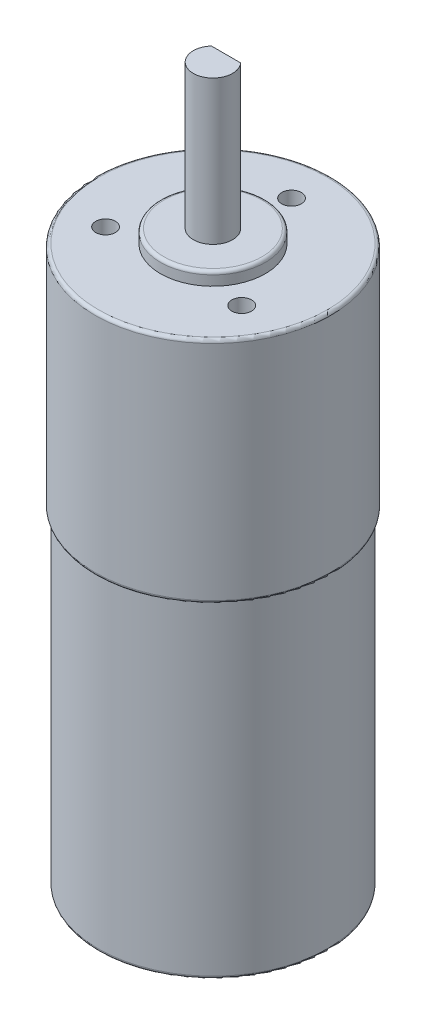
ISO-10303-21;
HEADER;
FILE_DESCRIPTION(('STEP AP214'),'2;1');
FILE_NAME('part.step','',(''),(''),'','','');
FILE_SCHEMA(('AUTOMOTIVE_DESIGN { 1 0 10303 214 1 1 1 1 }'));
ENDSEC;
DATA;
#1=APPLICATION_CONTEXT('core data for automotive mechanical design processes');
#2=APPLICATION_PROTOCOL_DEFINITION('international standard','automotive_design',2000,#1);
#3=PRODUCT_CONTEXT('',#1,'mechanical');
#4=PRODUCT('Part','Part','',(#3));
#5=PRODUCT_RELATED_PRODUCT_CATEGORY('part','',(#4));
#6=PRODUCT_DEFINITION_FORMATION('','',#4);
#7=PRODUCT_DEFINITION_CONTEXT('part definition',#1,'design');
#8=PRODUCT_DEFINITION('design','',#6,#7);
#9=PRODUCT_DEFINITION_SHAPE('','',#8);
#10=(LENGTH_UNIT() NAMED_UNIT(*) SI_UNIT(.MILLI.,.METRE.));
#11=(NAMED_UNIT(*) PLANE_ANGLE_UNIT() SI_UNIT($,.RADIAN.));
#12=(NAMED_UNIT(*) SI_UNIT($,.STERADIAN.) SOLID_ANGLE_UNIT());
#13=UNCERTAINTY_MEASURE_WITH_UNIT(LENGTH_MEASURE(1.E-05),#10,'distance_accuracy_value','');
#14=(GEOMETRIC_REPRESENTATION_CONTEXT(3) GLOBAL_UNCERTAINTY_ASSIGNED_CONTEXT((#13)) GLOBAL_UNIT_ASSIGNED_CONTEXT((#10,
#11,#12)) REPRESENTATION_CONTEXT('',''));
#15=CARTESIAN_POINT('',(0.,0.,0.));
#16=DIRECTION('',(0.,0.,1.));
#17=DIRECTION('',(1.,0.,0.));
#18=AXIS2_PLACEMENT_3D('',#15,#16,#17);
#19=CARTESIAN_POINT('',(0.,87.,0.));
#20=DIRECTION('',(0.,1.,0.));
#21=DIRECTION('',(0.,0.,1.));
#22=AXIS2_PLACEMENT_3D('',#19,#20,#21);
#23=PLANE('',#22);
#24=CARTESIAN_POINT('',(0.,87.,0.));
#25=DIRECTION('',(0.,1.,0.));
#26=DIRECTION('',(0.,0.,1.));
#27=AXIS2_PLACEMENT_3D('',#24,#25,#26);
#28=CIRCLE('',#27,7.5);
#29=CARTESIAN_POINT('',(0.,87.,7.5));
#30=VERTEX_POINT('',#29);
#31=EDGE_CURVE('E45',#30,#30,#28,.T.);
#32=ORIENTED_EDGE('',*,*,#31,.T.);
#33=EDGE_LOOP('',(#32));
#34=FACE_BOUND('',#33,.T.);
#35=CARTESIAN_POINT('',(0.,87.,0.));
#36=DIRECTION('',(0.,1.,0.));
#37=DIRECTION('',(0.,0.,1.));
#38=AXIS2_PLACEMENT_3D('',#35,#36,#37);
#39=CIRCLE('',#38,3.);
#40=CARTESIAN_POINT('',(0.,87.,3.));
#41=VERTEX_POINT('',#40);
#42=EDGE_CURVE('E80',#41,#41,#39,.T.);
#43=ORIENTED_EDGE('',*,*,#42,.F.);
#44=EDGE_LOOP('',(#43));
#45=FACE_BOUND('',#44,.T.);
#46=ADVANCED_FACE('F37',(#34,#45),#23,.T.);
#47=CARTESIAN_POINT('',(0.,85.,0.));
#48=DIRECTION('',(0.,1.,0.));
#49=DIRECTION('',(0.,0.,1.));
#50=AXIS2_PLACEMENT_3D('',#47,#48,#49);
#51=PLANE('',#50);
#52=CARTESIAN_POINT('',(0.,85.,0.));
#53=DIRECTION('',(0.,1.,0.));
#54=DIRECTION('',(0.,0.,1.));
#55=AXIS2_PLACEMENT_3D('',#52,#53,#54);
#56=CIRCLE('',#55,17.5);
#57=CARTESIAN_POINT('',(0.,85.,17.5));
#58=VERTEX_POINT('',#57);
#59=EDGE_CURVE('E94',#58,#58,#56,.T.);
#60=ORIENTED_EDGE('',*,*,#59,.T.);
#61=EDGE_LOOP('',(#60));
#62=FACE_BOUND('',#61,.T.);
#63=CARTESIAN_POINT('',(-10.3923048454128,85.,6.00000000000025));
#64=DIRECTION('',(0.,1.,0.));
#65=DIRECTION('',(0.,0.,1.));
#66=AXIS2_PLACEMENT_3D('',#63,#64,#65);
#67=CIRCLE('',#66,1.5);
#68=CARTESIAN_POINT('',(-10.3923048454128,85.,7.50000000000025));
#69=VERTEX_POINT('',#68);
#70=EDGE_CURVE('E168',#69,#69,#67,.T.);
#71=ORIENTED_EDGE('',*,*,#70,.F.);
#72=EDGE_LOOP('',(#71));
#73=FACE_BOUND('',#72,.T.);
#74=CARTESIAN_POINT('',(10.3923048454137,85.,5.99999999999975));
#75=DIRECTION('',(0.,1.,0.));
#76=DIRECTION('',(0.,0.,1.));
#77=AXIS2_PLACEMENT_3D('',#74,#75,#76);
#78=CIRCLE('',#77,1.5);
#79=CARTESIAN_POINT('',(10.3923048454137,85.,7.49999999999975));
#80=VERTEX_POINT('',#79);
#81=EDGE_CURVE('E172',#80,#80,#78,.T.);
#82=ORIENTED_EDGE('',*,*,#81,.F.);
#83=EDGE_LOOP('',(#82));
#84=FACE_BOUND('',#83,.T.);
#85=CARTESIAN_POINT('',(0.,85.,-12.));
#86=DIRECTION('',(0.,1.,0.));
#87=DIRECTION('',(0.,0.,1.));
#88=AXIS2_PLACEMENT_3D('',#85,#86,#87);
#89=CIRCLE('',#88,1.5);
#90=CARTESIAN_POINT('',(0.,85.,-10.5));
#91=VERTEX_POINT('',#90);
#92=EDGE_CURVE('E88',#91,#91,#89,.T.);
#93=ORIENTED_EDGE('',*,*,#92,.F.);
#94=EDGE_LOOP('',(#93));
#95=FACE_BOUND('',#94,.T.);
#96=CARTESIAN_POINT('',(0.,85.,0.));
#97=DIRECTION('',(0.,1.,0.));
#98=DIRECTION('',(0.,0.,1.));
#99=AXIS2_PLACEMENT_3D('',#96,#97,#98);
#100=CIRCLE('',#99,8.);
#101=CARTESIAN_POINT('',(0.,85.,8.));
#102=VERTEX_POINT('',#101);
#103=EDGE_CURVE('E79',#102,#102,#100,.T.);
#104=ORIENTED_EDGE('',*,*,#103,.F.);
#105=EDGE_LOOP('',(#104));
#106=FACE_BOUND('',#105,.T.);
#107=ADVANCED_FACE('F123',(#62,#73,#84,#95,#106),#51,.T.);
#108=CARTESIAN_POINT('',(0.,50.,0.));
#109=DIRECTION('',(0.,-1.,0.));
#110=DIRECTION('',(0.,0.,-1.));
#111=AXIS2_PLACEMENT_3D('',#108,#109,#110);
#112=CYLINDRICAL_SURFACE('',#111,17.5);
#113=CARTESIAN_POINT('',(0.,0.5,0.));
#114=DIRECTION('',(0.,1.,0.));
#115=DIRECTION('',(0.,0.,1.));
#116=AXIS2_PLACEMENT_3D('',#113,#114,#115);
#117=CIRCLE('',#116,17.5);
#118=CARTESIAN_POINT('',(0.,0.5,17.5));
#119=VERTEX_POINT('',#118);
#120=EDGE_CURVE('E103',#119,#119,#117,.T.);
#121=ORIENTED_EDGE('',*,*,#120,.T.);
#122=EDGE_LOOP('',(#121));
#123=FACE_BOUND('',#122,.T.);
#124=CARTESIAN_POINT('',(0.,50.,0.));
#125=DIRECTION('',(0.,1.,0.));
#126=DIRECTION('',(0.,0.,1.));
#127=AXIS2_PLACEMENT_3D('',#124,#125,#126);
#128=CIRCLE('',#127,17.5);
#129=CARTESIAN_POINT('',(0.,50.,17.5));
#130=VERTEX_POINT('',#129);
#131=EDGE_CURVE('E69',#130,#130,#128,.T.);
#132=ORIENTED_EDGE('',*,*,#131,.F.);
#133=EDGE_LOOP('',(#132));
#134=FACE_BOUND('',#133,.T.);
#135=ADVANCED_FACE('F128',(#123,#134),#112,.T.);
#136=CARTESIAN_POINT('',(0.,0.,0.));
#137=DIRECTION('',(0.,1.,0.));
#138=DIRECTION('',(0.,0.,1.));
#139=AXIS2_PLACEMENT_3D('',#136,#137,#138);
#140=PLANE('',#139);
#141=CARTESIAN_POINT('',(0.,0.,0.));
#142=DIRECTION('',(0.,1.,0.));
#143=DIRECTION('',(0.,0.,1.));
#144=AXIS2_PLACEMENT_3D('',#141,#142,#143);
#145=CIRCLE('',#144,17.);
#146=CARTESIAN_POINT('',(0.,0.,17.));
#147=VERTEX_POINT('',#146);
#148=EDGE_CURVE('E106',#147,#147,#145,.F.);
#149=ORIENTED_EDGE('',*,*,#148,.T.);
#150=EDGE_LOOP('',(#149));
#151=FACE_BOUND('',#150,.T.);
#152=ADVANCED_FACE('F141',(#151),#140,.F.);
#153=CARTESIAN_POINT('',(0.,85.,0.));
#154=DIRECTION('',(0.,-1.,0.));
#155=DIRECTION('',(0.,0.,-1.));
#156=AXIS2_PLACEMENT_3D('',#153,#154,#155);
#157=CYLINDRICAL_SURFACE('',#156,18.);
#158=CARTESIAN_POINT('',(0.,50.5,0.));
#159=DIRECTION('',(0.,1.,0.));
#160=DIRECTION('',(0.,0.,1.));
#161=AXIS2_PLACEMENT_3D('',#158,#159,#160);
#162=CIRCLE('',#161,18.);
#163=CARTESIAN_POINT('',(0.,50.5,18.));
#164=VERTEX_POINT('',#163);
#165=EDGE_CURVE('E100',#164,#164,#162,.T.);
#166=ORIENTED_EDGE('',*,*,#165,.T.);
#167=EDGE_LOOP('',(#166));
#168=FACE_BOUND('',#167,.T.);
#169=CARTESIAN_POINT('',(0.,84.5,0.));
#170=DIRECTION('',(0.,1.,0.));
#171=DIRECTION('',(0.,0.,1.));
#172=AXIS2_PLACEMENT_3D('',#169,#170,#171);
#173=CIRCLE('',#172,18.);
#174=CARTESIAN_POINT('',(0.,84.5,18.));
#175=VERTEX_POINT('',#174);
#176=EDGE_CURVE('E97',#175,#175,#173,.F.);
#177=ORIENTED_EDGE('',*,*,#176,.T.);
#178=EDGE_LOOP('',(#177));
#179=FACE_BOUND('',#178,.T.);
#180=ADVANCED_FACE('F136',(#168,#179),#157,.T.);
#181=CARTESIAN_POINT('',(0.,87.,0.));
#182=DIRECTION('',(0.,-1.,0.));
#183=DIRECTION('',(0.,0.,-1.));
#184=AXIS2_PLACEMENT_3D('',#181,#182,#183);
#185=CYLINDRICAL_SURFACE('',#184,8.);
#186=CARTESIAN_POINT('',(0.,86.5,0.));
#187=DIRECTION('',(0.,1.,0.));
#188=DIRECTION('',(0.,0.,1.));
#189=AXIS2_PLACEMENT_3D('',#186,#187,#188);
#190=CIRCLE('',#189,8.);
#191=CARTESIAN_POINT('',(0.,86.5,8.));
#192=VERTEX_POINT('',#191);
#193=EDGE_CURVE('E11',#192,#192,#190,.F.);
#194=ORIENTED_EDGE('',*,*,#193,.T.);
#195=EDGE_LOOP('',(#194));
#196=FACE_BOUND('',#195,.T.);
#197=ORIENTED_EDGE('',*,*,#103,.T.);
#198=EDGE_LOOP('',(#197));
#199=FACE_BOUND('',#198,.T.);
#200=ADVANCED_FACE('F134',(#196,#199),#185,.T.);
#201=CARTESIAN_POINT('',(0.,109.,0.));
#202=DIRECTION('',(0.,-1.,0.));
#203=DIRECTION('',(0.,0.,-1.));
#204=AXIS2_PLACEMENT_3D('',#201,#202,#203);
#205=CYLINDRICAL_SURFACE('',#204,3.);
#206=CARTESIAN_POINT('',(0.,109.,0.));
#207=DIRECTION('',(0.,1.,0.));
#208=DIRECTION('',(0.,0.,1.));
#209=AXIS2_PLACEMENT_3D('',#206,#207,#208);
#210=CIRCLE('',#209,3.);
#211=CARTESIAN_POINT('',(-2.23606797749979,109.,-2.));
#212=VERTEX_POINT('',#211);
#213=CARTESIAN_POINT('',(2.23606797749979,109.,-2.));
#214=VERTEX_POINT('',#213);
#215=EDGE_CURVE('E75',#212,#214,#210,.T.);
#216=ORIENTED_EDGE('',*,*,#215,.F.);
#217=DIRECTION('',(0.,-1.,0.));
#218=VECTOR('',#217,1.);
#219=CARTESIAN_POINT('',(-2.23606797749979,109.,-2.));
#220=LINE('',#219,#218);
#221=CARTESIAN_POINT('',(-2.23606797749979,91.,-2.));
#222=VERTEX_POINT('',#221);
#223=EDGE_CURVE('E52',#212,#222,#220,.T.);
#224=ORIENTED_EDGE('',*,*,#223,.T.);
#225=CARTESIAN_POINT('',(0.,91.,0.));
#226=DIRECTION('',(0.,1.,0.));
#227=DIRECTION('',(0.,0.,1.));
#228=AXIS2_PLACEMENT_3D('',#225,#226,#227);
#229=CIRCLE('',#228,3.);
#230=CARTESIAN_POINT('',(2.23606797749979,91.,-2.));
#231=VERTEX_POINT('',#230);
#232=EDGE_CURVE('E68',#231,#222,#229,.T.);
#233=ORIENTED_EDGE('',*,*,#232,.F.);
#234=DIRECTION('',(0.,-1.,0.));
#235=VECTOR('',#234,1.);
#236=CARTESIAN_POINT('',(2.23606797749979,109.,-2.));
#237=LINE('',#236,#235);
#238=EDGE_CURVE('E57',#231,#214,#237,.F.);
#239=ORIENTED_EDGE('',*,*,#238,.T.);
#240=EDGE_LOOP('',(#216,#224,#233,#239));
#241=FACE_BOUND('',#240,.T.);
#242=ORIENTED_EDGE('',*,*,#42,.T.);
#243=EDGE_LOOP('',(#242));
#244=FACE_BOUND('',#243,.T.);
#245=ADVANCED_FACE('F73',(#241,#244),#205,.T.);
#246=CARTESIAN_POINT('',(0.,109.,0.));
#247=DIRECTION('',(0.,1.,0.));
#248=DIRECTION('',(0.,0.,1.));
#249=AXIS2_PLACEMENT_3D('',#246,#247,#248);
#250=PLANE('',#249);
#251=DIRECTION('',(1.,0.,0.));
#252=VECTOR('',#251,1.);
#253=CARTESIAN_POINT('',(0.,109.,-2.));
#254=LINE('',#253,#252);
#255=EDGE_CURVE('E63',#212,#214,#254,.T.);
#256=ORIENTED_EDGE('',*,*,#255,.F.);
#257=ORIENTED_EDGE('',*,*,#215,.T.);
#258=EDGE_LOOP('',(#256,#257));
#259=FACE_BOUND('',#258,.T.);
#260=ADVANCED_FACE('F78',(#259),#250,.T.);
#261=CARTESIAN_POINT('',(0.,80.,-12.));
#262=DIRECTION('',(0.,1.,0.));
#263=DIRECTION('',(0.,0.,1.));
#264=AXIS2_PLACEMENT_3D('',#261,#262,#263);
#265=CYLINDRICAL_SURFACE('',#264,1.5);
#266=CARTESIAN_POINT('',(0.,80.,-12.));
#267=DIRECTION('',(0.,1.,0.));
#268=DIRECTION('',(0.,0.,1.));
#269=AXIS2_PLACEMENT_3D('',#266,#267,#268);
#270=CIRCLE('',#269,1.5);
#271=CARTESIAN_POINT('',(0.,80.,-10.5));
#272=VERTEX_POINT('',#271);
#273=EDGE_CURVE('E85',#272,#272,#270,.T.);
#274=ORIENTED_EDGE('',*,*,#273,.F.);
#275=EDGE_LOOP('',(#274));
#276=FACE_BOUND('',#275,.T.);
#277=ORIENTED_EDGE('',*,*,#92,.T.);
#278=EDGE_LOOP('',(#277));
#279=FACE_BOUND('',#278,.T.);
#280=ADVANCED_FACE('F219',(#276,#279),#265,.F.);
#281=CARTESIAN_POINT('',(0.,80.,-12.));
#282=DIRECTION('',(0.,1.,0.));
#283=DIRECTION('',(0.,0.,1.));
#284=AXIS2_PLACEMENT_3D('',#281,#282,#283);
#285=PLANE('',#284);
#286=ORIENTED_EDGE('',*,*,#273,.T.);
#287=EDGE_LOOP('',(#286));
#288=FACE_BOUND('',#287,.T.);
#289=ADVANCED_FACE('F215',(#288),#285,.T.);
#290=CARTESIAN_POINT('',(10.3923048454137,80.,5.99999999999975));
#291=DIRECTION('',(0.,1.,0.));
#292=DIRECTION('',(0.,0.,1.));
#293=AXIS2_PLACEMENT_3D('',#290,#291,#292);
#294=CYLINDRICAL_SURFACE('',#293,1.5);
#295=CARTESIAN_POINT('',(10.3923048454137,80.,5.99999999999975));
#296=DIRECTION('',(0.,1.,0.));
#297=DIRECTION('',(0.,0.,1.));
#298=AXIS2_PLACEMENT_3D('',#295,#296,#297);
#299=CIRCLE('',#298,1.5);
#300=CARTESIAN_POINT('',(10.3923048454137,80.,7.49999999999975));
#301=VERTEX_POINT('',#300);
#302=EDGE_CURVE('E179',#301,#301,#299,.T.);
#303=ORIENTED_EDGE('',*,*,#302,.F.);
#304=EDGE_LOOP('',(#303));
#305=FACE_BOUND('',#304,.T.);
#306=ORIENTED_EDGE('',*,*,#81,.T.);
#307=EDGE_LOOP('',(#306));
#308=FACE_BOUND('',#307,.T.);
#309=ADVANCED_FACE('F212',(#305,#308),#294,.F.);
#310=CARTESIAN_POINT('',(10.3923048454137,80.,5.99999999999975));
#311=DIRECTION('',(0.,1.,0.));
#312=DIRECTION('',(0.,0.,1.));
#313=AXIS2_PLACEMENT_3D('',#310,#311,#312);
#314=PLANE('',#313);
#315=ORIENTED_EDGE('',*,*,#302,.T.);
#316=EDGE_LOOP('',(#315));
#317=FACE_BOUND('',#316,.T.);
#318=ADVANCED_FACE('F208',(#317),#314,.T.);
#319=CARTESIAN_POINT('',(-10.3923048454128,80.,6.00000000000025));
#320=DIRECTION('',(0.,1.,0.));
#321=DIRECTION('',(0.,0.,1.));
#322=AXIS2_PLACEMENT_3D('',#319,#320,#321);
#323=CYLINDRICAL_SURFACE('',#322,1.5);
#324=CARTESIAN_POINT('',(-10.3923048454128,80.,6.00000000000025));
#325=DIRECTION('',(0.,1.,0.));
#326=DIRECTION('',(0.,0.,1.));
#327=AXIS2_PLACEMENT_3D('',#324,#325,#326);
#328=CIRCLE('',#327,1.5);
#329=CARTESIAN_POINT('',(-10.3923048454128,80.,7.50000000000025));
#330=VERTEX_POINT('',#329);
#331=EDGE_CURVE('E185',#330,#330,#328,.T.);
#332=ORIENTED_EDGE('',*,*,#331,.F.);
#333=EDGE_LOOP('',(#332));
#334=FACE_BOUND('',#333,.T.);
#335=ORIENTED_EDGE('',*,*,#70,.T.);
#336=EDGE_LOOP('',(#335));
#337=FACE_BOUND('',#336,.T.);
#338=ADVANCED_FACE('F202',(#334,#337),#323,.F.);
#339=CARTESIAN_POINT('',(-10.3923048454128,80.,6.00000000000025));
#340=DIRECTION('',(0.,1.,0.));
#341=DIRECTION('',(0.,0.,1.));
#342=AXIS2_PLACEMENT_3D('',#339,#340,#341);
#343=PLANE('',#342);
#344=ORIENTED_EDGE('',*,*,#331,.T.);
#345=EDGE_LOOP('',(#344));
#346=FACE_BOUND('',#345,.T.);
#347=ADVANCED_FACE('F195',(#346),#343,.T.);
#348=CARTESIAN_POINT('',(0.,91.,0.));
#349=DIRECTION('',(0.,1.,0.));
#350=DIRECTION('',(0.,0.,1.));
#351=AXIS2_PLACEMENT_3D('',#348,#349,#350);
#352=PLANE('',#351);
#353=ORIENTED_EDGE('',*,*,#232,.T.);
#354=DIRECTION('',(1.,0.,0.));
#355=VECTOR('',#354,1.);
#356=CARTESIAN_POINT('',(-4.44576170717249,91.,-2.));
#357=LINE('',#356,#355);
#358=EDGE_CURVE('E76',#222,#231,#357,.T.);
#359=ORIENTED_EDGE('',*,*,#358,.T.);
#360=EDGE_LOOP('',(#353,#359));
#361=FACE_BOUND('',#360,.T.);
#362=ADVANCED_FACE('F193',(#361),#352,.T.);
#363=CARTESIAN_POINT('',(-4.44576170717249,91.,-2.));
#364=DIRECTION('',(0.,0.,1.));
#365=DIRECTION('',(1.,0.,0.));
#366=AXIS2_PLACEMENT_3D('',#363,#364,#365);
#367=PLANE('',#366);
#368=ORIENTED_EDGE('',*,*,#255,.T.);
#369=ORIENTED_EDGE('',*,*,#238,.F.);
#370=ORIENTED_EDGE('',*,*,#358,.F.);
#371=ORIENTED_EDGE('',*,*,#223,.F.);
#372=EDGE_LOOP('',(#368,#369,#370,#371));
#373=FACE_BOUND('',#372,.T.);
#374=ADVANCED_FACE('F64',(#373),#367,.F.);
#375=CARTESIAN_POINT('',(0.,84.5,0.));
#376=DIRECTION('',(0.,1.,0.));
#377=DIRECTION('',(0.,0.,1.));
#378=AXIS2_PLACEMENT_3D('',#375,#376,#377);
#379=TOROIDAL_SURFACE('',#378,17.5,0.5);
#380=ORIENTED_EDGE('',*,*,#176,.F.);
#381=EDGE_LOOP('',(#380));
#382=FACE_BOUND('',#381,.T.);
#383=ORIENTED_EDGE('',*,*,#59,.F.);
#384=EDGE_LOOP('',(#383));
#385=FACE_BOUND('',#384,.T.);
#386=ADVANCED_FACE('F149',(#382,#385),#379,.T.);
#387=CARTESIAN_POINT('',(0.,50.5,0.));
#388=DIRECTION('',(0.,1.,0.));
#389=DIRECTION('',(0.,0.,1.));
#390=AXIS2_PLACEMENT_3D('',#387,#388,#389);
#391=TOROIDAL_SURFACE('',#390,17.5,0.5);
#392=ORIENTED_EDGE('',*,*,#131,.T.);
#393=EDGE_LOOP('',(#392));
#394=FACE_BOUND('',#393,.T.);
#395=ORIENTED_EDGE('',*,*,#165,.F.);
#396=EDGE_LOOP('',(#395));
#397=FACE_BOUND('',#396,.T.);
#398=ADVANCED_FACE('F119',(#394,#397),#391,.T.);
#399=CARTESIAN_POINT('',(0.,0.5,0.));
#400=DIRECTION('',(0.,1.,0.));
#401=DIRECTION('',(0.,0.,1.));
#402=AXIS2_PLACEMENT_3D('',#399,#400,#401);
#403=TOROIDAL_SURFACE('',#402,17.,0.5);
#404=ORIENTED_EDGE('',*,*,#148,.F.);
#405=EDGE_LOOP('',(#404));
#406=FACE_BOUND('',#405,.T.);
#407=ORIENTED_EDGE('',*,*,#120,.F.);
#408=EDGE_LOOP('',(#407));
#409=FACE_BOUND('',#408,.T.);
#410=ADVANCED_FACE('F114',(#406,#409),#403,.T.);
#411=CARTESIAN_POINT('',(0.,86.5,0.));
#412=DIRECTION('',(0.,1.,0.));
#413=DIRECTION('',(0.,0.,1.));
#414=AXIS2_PLACEMENT_3D('',#411,#412,#413);
#415=TOROIDAL_SURFACE('',#414,7.5,0.5);
#416=ORIENTED_EDGE('',*,*,#193,.F.);
#417=EDGE_LOOP('',(#416));
#418=FACE_BOUND('',#417,.T.);
#419=ORIENTED_EDGE('',*,*,#31,.F.);
#420=EDGE_LOOP('',(#419));
#421=FACE_BOUND('',#420,.T.);
#422=ADVANCED_FACE('F39',(#418,#421),#415,.T.);
#423=CLOSED_SHELL('',(#46,#107,#135,#152,#180,#200,#245,#260,#280,#289,#309,#318,#338,#347,#362,
#374,#386,#398,#410,#422));
#424=MANIFOLD_SOLID_BREP('B2',#423);
#425=ADVANCED_BREP_SHAPE_REPRESENTATION('',(#18,#424),#14);
#426=SHAPE_DEFINITION_REPRESENTATION(#9,#425);
ENDSEC;
END-ISO-10303-21;
